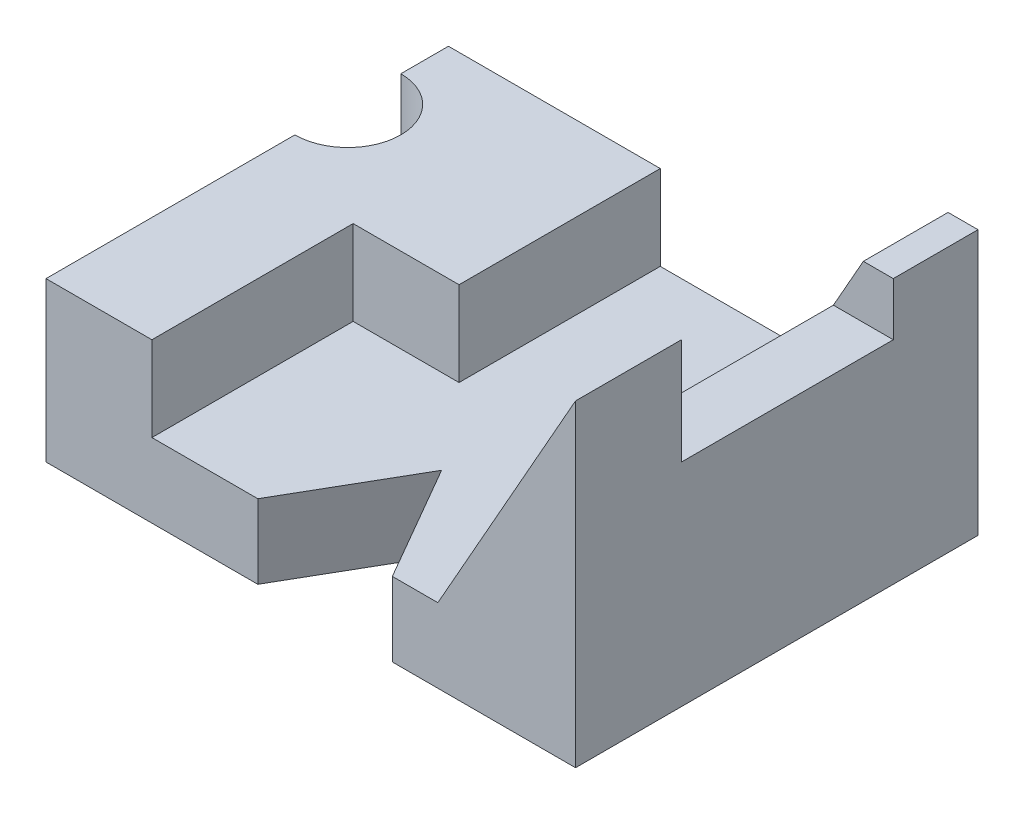
ISO-10303-21;
HEADER;
FILE_DESCRIPTION(('STEP AP214'),'2;1');
FILE_NAME('part.step','',(''),(''),'','','');
FILE_SCHEMA(('AUTOMOTIVE_DESIGN { 1 0 10303 214 1 1 1 1 }'));
ENDSEC;
DATA;
#1=APPLICATION_CONTEXT('core data for automotive mechanical design processes');
#2=APPLICATION_PROTOCOL_DEFINITION('international standard','automotive_design',2000,#1);
#3=PRODUCT_CONTEXT('',#1,'mechanical');
#4=PRODUCT('Part','Part','',(#3));
#5=PRODUCT_RELATED_PRODUCT_CATEGORY('part','',(#4));
#6=PRODUCT_DEFINITION_FORMATION('','',#4);
#7=PRODUCT_DEFINITION_CONTEXT('part definition',#1,'design');
#8=PRODUCT_DEFINITION('design','',#6,#7);
#9=PRODUCT_DEFINITION_SHAPE('','',#8);
#10=(LENGTH_UNIT() NAMED_UNIT(*) SI_UNIT(.MILLI.,.METRE.));
#11=(NAMED_UNIT(*) PLANE_ANGLE_UNIT() SI_UNIT($,.RADIAN.));
#12=(NAMED_UNIT(*) SI_UNIT($,.STERADIAN.) SOLID_ANGLE_UNIT());
#13=UNCERTAINTY_MEASURE_WITH_UNIT(LENGTH_MEASURE(1.E-05),#10,'distance_accuracy_value','');
#14=(GEOMETRIC_REPRESENTATION_CONTEXT(3) GLOBAL_UNCERTAINTY_ASSIGNED_CONTEXT((#13)) GLOBAL_UNIT_ASSIGNED_CONTEXT((#10,
#11,#12)) REPRESENTATION_CONTEXT('',''));
#15=CARTESIAN_POINT('',(0.,0.,0.));
#16=DIRECTION('',(0.,0.,1.));
#17=DIRECTION('',(1.,0.,0.));
#18=AXIS2_PLACEMENT_3D('',#15,#16,#17);
#19=CARTESIAN_POINT('',(0.,0.,38.));
#20=DIRECTION('',(0.,0.,1.));
#21=DIRECTION('',(1.,0.,0.));
#22=AXIS2_PLACEMENT_3D('',#19,#20,#21);
#23=PLANE('',#22);
#24=DIRECTION('',(0.,1.,0.));
#25=VECTOR('',#24,1.);
#26=CARTESIAN_POINT('',(-5.00000000000001,-15.,38.));
#27=LINE('',#26,#25);
#28=CARTESIAN_POINT('',(-5.00000000000001,-15.,38.));
#29=VERTEX_POINT('',#28);
#30=CARTESIAN_POINT('',(-5.00000000000001,-8.,38.));
#31=VERTEX_POINT('',#30);
#32=EDGE_CURVE('E356',#29,#31,#27,.T.);
#33=ORIENTED_EDGE('',*,*,#32,.T.);
#34=DIRECTION('',(1.,0.,0.));
#35=VECTOR('',#34,1.);
#36=CARTESIAN_POINT('',(0.,-8.,38.));
#37=LINE('',#36,#35);
#38=CARTESIAN_POINT('',(-15.,-8.,38.));
#39=VERTEX_POINT('',#38);
#40=EDGE_CURVE('E303',#39,#31,#37,.T.);
#41=ORIENTED_EDGE('',*,*,#40,.F.);
#42=DIRECTION('',(0.,1.,0.));
#43=VECTOR('',#42,1.);
#44=CARTESIAN_POINT('',(-15.,-29.4709105535839,38.));
#45=LINE('',#44,#43);
#46=CARTESIAN_POINT('',(-15.,0.,38.));
#47=VERTEX_POINT('',#46);
#48=EDGE_CURVE('E288',#39,#47,#45,.T.);
#49=ORIENTED_EDGE('',*,*,#48,.T.);
#50=DIRECTION('',(1.,0.,0.));
#51=VECTOR('',#50,1.);
#52=CARTESIAN_POINT('',(0.,0.,38.));
#53=LINE('',#52,#51);
#54=CARTESIAN_POINT('',(-25.,0.,38.));
#55=VERTEX_POINT('',#54);
#56=EDGE_CURVE('E306',#55,#47,#53,.T.);
#57=ORIENTED_EDGE('',*,*,#56,.F.);
#58=DIRECTION('',(0.,1.,0.));
#59=VECTOR('',#58,1.);
#60=CARTESIAN_POINT('',(-25.,0.,38.));
#61=LINE('',#60,#59);
#62=CARTESIAN_POINT('',(-25.,-15.,38.));
#63=VERTEX_POINT('',#62);
#64=EDGE_CURVE('E309',#63,#55,#61,.T.);
#65=ORIENTED_EDGE('',*,*,#64,.F.);
#66=DIRECTION('',(1.,0.,0.));
#67=VECTOR('',#66,1.);
#68=CARTESIAN_POINT('',(0.,-15.,38.));
#69=LINE('',#68,#67);
#70=EDGE_CURVE('E216',#63,#29,#69,.T.);
#71=ORIENTED_EDGE('',*,*,#70,.T.);
#72=EDGE_LOOP('',(#33,#41,#49,#57,#65,#71));
#73=FACE_BOUND('',#72,.T.);
#74=ADVANCED_FACE('F34',(#73),#23,.T.);
#75=CARTESIAN_POINT('',(-25.,0.,38.));
#76=DIRECTION('',(-1.,0.,0.));
#77=DIRECTION('',(0.,0.,1.));
#78=AXIS2_PLACEMENT_3D('',#75,#76,#77);
#79=PLANE('',#78);
#80=DIRECTION('',(0.,1.,0.));
#81=VECTOR('',#80,1.);
#82=CARTESIAN_POINT('',(-25.,0.,11.5));
#83=LINE('',#82,#81);
#84=CARTESIAN_POINT('',(-25.,-15.,11.5));
#85=VERTEX_POINT('',#84);
#86=CARTESIAN_POINT('',(-25.,-8.,11.5));
#87=VERTEX_POINT('',#86);
#88=EDGE_CURVE('E250',#85,#87,#83,.T.);
#89=ORIENTED_EDGE('',*,*,#88,.F.);
#90=DIRECTION('',(0.,0.,-1.));
#91=VECTOR('',#90,1.);
#92=CARTESIAN_POINT('',(-25.,-15.,38.));
#93=LINE('',#92,#91);
#94=EDGE_CURVE('E222',#63,#85,#93,.T.);
#95=ORIENTED_EDGE('',*,*,#94,.F.);
#96=ORIENTED_EDGE('',*,*,#64,.T.);
#97=DIRECTION('',(0.,0.,-1.));
#98=VECTOR('',#97,1.);
#99=CARTESIAN_POINT('',(-25.,0.,38.));
#100=LINE('',#99,#98);
#101=CARTESIAN_POINT('',(-25.,0.,14.5));
#102=VERTEX_POINT('',#101);
#103=EDGE_CURVE('E226',#55,#102,#100,.T.);
#104=ORIENTED_EDGE('',*,*,#103,.T.);
#105=DIRECTION('',(0.,1.,0.));
#106=VECTOR('',#105,1.);
#107=CARTESIAN_POINT('',(-25.,-29.4709105535839,14.5));
#108=LINE('',#107,#106);
#109=CARTESIAN_POINT('',(-25.,-8.,14.5));
#110=VERTEX_POINT('',#109);
#111=EDGE_CURVE('E242',#110,#102,#108,.T.);
#112=ORIENTED_EDGE('',*,*,#111,.F.);
#113=DIRECTION('',(0.,0.,-1.));
#114=VECTOR('',#113,1.);
#115=CARTESIAN_POINT('',(-25.,-8.,38.));
#116=LINE('',#115,#114);
#117=EDGE_CURVE('E236',#110,#87,#116,.T.);
#118=ORIENTED_EDGE('',*,*,#117,.T.);
#119=EDGE_LOOP('',(#89,#95,#96,#104,#112,#118));
#120=FACE_BOUND('',#119,.T.);
#121=ADVANCED_FACE('F370',(#120),#79,.T.);
#122=CARTESIAN_POINT('',(12.5214899713467,-7.07736389684813,38.));
#123=DIRECTION('',(-0.870562838720134,0.492057256667902,0.));
#124=DIRECTION('',(-0.492057256667902,-0.870562838720134,0.));
#125=AXIS2_PLACEMENT_3D('',#122,#123,#124);
#126=PLANE('',#125);
#127=DIRECTION('',(0.,0.,1.));
#128=VECTOR('',#127,1.);
#129=CARTESIAN_POINT('',(22.1739130434783,10.,38.));
#130=LINE('',#129,#128);
#131=CARTESIAN_POINT('',(22.1739130434783,10.,0.));
#132=VERTEX_POINT('',#131);
#133=CARTESIAN_POINT('',(22.1739130434782,10.,8.));
#134=VERTEX_POINT('',#133);
#135=EDGE_CURVE('E193',#132,#134,#130,.T.);
#136=ORIENTED_EDGE('',*,*,#135,.F.);
#137=DIRECTION('',(0.492057256667902,0.870562838720134,0.));
#138=VECTOR('',#137,1.);
#139=CARTESIAN_POINT('',(12.5214899713467,-7.07736389684813,0.));
#140=LINE('',#139,#138);
#141=CARTESIAN_POINT('',(12.,-8.,0.));
#142=VERTEX_POINT('',#141);
#143=EDGE_CURVE('E300',#142,#132,#140,.T.);
#144=ORIENTED_EDGE('',*,*,#143,.F.);
#145=DIRECTION('',(0.,0.,-1.));
#146=VECTOR('',#145,1.);
#147=CARTESIAN_POINT('',(12.,-8.,38.));
#148=LINE('',#147,#146);
#149=CARTESIAN_POINT('',(12.,-8.,38.));
#150=VERTEX_POINT('',#149);
#151=EDGE_CURVE('E233',#150,#142,#148,.T.);
#152=ORIENTED_EDGE('',*,*,#151,.F.);
#153=DIRECTION('',(0.492057256667902,0.870562838720134,0.));
#154=VECTOR('',#153,1.);
#155=CARTESIAN_POINT('',(12.5214899713467,-7.07736389684813,38.));
#156=LINE('',#155,#154);
#157=CARTESIAN_POINT('',(25.,15.,38.));
#158=VERTEX_POINT('',#157);
#159=EDGE_CURVE('E209',#150,#158,#156,.T.);
#160=ORIENTED_EDGE('',*,*,#159,.T.);
#161=DIRECTION('',(0.,0.,-1.));
#162=VECTOR('',#161,1.);
#163=CARTESIAN_POINT('',(25.,15.,38.));
#164=LINE('',#163,#162);
#165=CARTESIAN_POINT('',(25.,15.,28.));
#166=VERTEX_POINT('',#165);
#167=EDGE_CURVE('E200',#158,#166,#164,.T.);
#168=ORIENTED_EDGE('',*,*,#167,.T.);
#169=DIRECTION('',(0.492057256667902,0.870562838720134,0.));
#170=VECTOR('',#169,1.);
#171=CARTESIAN_POINT('',(12.5214899713467,-7.07736389684814,28.));
#172=LINE('',#171,#170);
#173=CARTESIAN_POINT('',(19.3478260869565,4.99999999999999,28.));
#174=VERTEX_POINT('',#173);
#175=EDGE_CURVE('E183',#174,#166,#172,.T.);
#176=ORIENTED_EDGE('',*,*,#175,.F.);
#177=DIRECTION('',(0.,0.,1.));
#178=VECTOR('',#177,1.);
#179=CARTESIAN_POINT('',(19.3478260869565,5.,38.));
#180=LINE('',#179,#178);
#181=CARTESIAN_POINT('',(19.3478260869565,5.,8.));
#182=VERTEX_POINT('',#181);
#183=EDGE_CURVE('E192',#182,#174,#180,.T.);
#184=ORIENTED_EDGE('',*,*,#183,.F.);
#185=DIRECTION('',(-0.492057256667902,-0.870562838720134,0.));
#186=VECTOR('',#185,1.);
#187=CARTESIAN_POINT('',(12.5214899713467,-7.07736389684813,7.99999999999999));
#188=LINE('',#187,#186);
#189=EDGE_CURVE('E340',#134,#182,#188,.T.);
#190=ORIENTED_EDGE('',*,*,#189,.F.);
#191=EDGE_LOOP('',(#136,#144,#152,#160,#168,#176,#184,#190));
#192=FACE_BOUND('',#191,.T.);
#193=ADVANCED_FACE('F36',(#192),#126,.T.);
#194=CARTESIAN_POINT('',(0.,-8.,38.));
#195=DIRECTION('',(0.,1.,0.));
#196=DIRECTION('',(0.,0.,1.));
#197=AXIS2_PLACEMENT_3D('',#194,#195,#196);
#198=PLANE('',#197);
#199=DIRECTION('',(-0.5,0.,0.866025403784439));
#200=VECTOR('',#199,1.);
#201=CARTESIAN_POINT('',(1.35085296108587,-8.,27.));
#202=LINE('',#201,#200);
#203=CARTESIAN_POINT('',(1.35085296108587,-8.,27.));
#204=VERTEX_POINT('',#203);
#205=EDGE_CURVE('E350',#204,#31,#202,.T.);
#206=ORIENTED_EDGE('',*,*,#205,.F.);
#207=DIRECTION('',(-0.5,0.,-0.866025403784438));
#208=VECTOR('',#207,1.);
#209=CARTESIAN_POINT('',(1.35085296108587,-8.,27.));
#210=LINE('',#209,#208);
#211=CARTESIAN_POINT('',(7.70170592217175,-8.,38.));
#212=VERTEX_POINT('',#211);
#213=EDGE_CURVE('E354',#212,#204,#210,.T.);
#214=ORIENTED_EDGE('',*,*,#213,.F.);
#215=EDGE_CURVE('E302',#212,#150,#37,.T.);
#216=ORIENTED_EDGE('',*,*,#215,.T.);
#217=ORIENTED_EDGE('',*,*,#151,.T.);
#218=DIRECTION('',(1.,0.,0.));
#219=VECTOR('',#218,1.);
#220=CARTESIAN_POINT('',(0.,-8.,0.));
#221=LINE('',#220,#219);
#222=CARTESIAN_POINT('',(-5.00000000000001,-8.,0.));
#223=VERTEX_POINT('',#222);
#224=EDGE_CURVE('E317',#223,#142,#221,.T.);
#225=ORIENTED_EDGE('',*,*,#224,.F.);
#226=DIRECTION('',(0.,0.,-1.));
#227=VECTOR('',#226,1.);
#228=CARTESIAN_POINT('',(-5.00000000000001,-8.,38.));
#229=LINE('',#228,#227);
#230=CARTESIAN_POINT('',(-5.00000000000001,-8.,19.));
#231=VERTEX_POINT('',#230);
#232=EDGE_CURVE('E231',#231,#223,#229,.T.);
#233=ORIENTED_EDGE('',*,*,#232,.F.);
#234=DIRECTION('',(1.,0.,0.));
#235=VECTOR('',#234,1.);
#236=CARTESIAN_POINT('',(-5.00000000000001,-8.,19.));
#237=LINE('',#236,#235);
#238=CARTESIAN_POINT('',(-15.,-8.,19.));
#239=VERTEX_POINT('',#238);
#240=EDGE_CURVE('E287',#239,#231,#237,.T.);
#241=ORIENTED_EDGE('',*,*,#240,.F.);
#242=DIRECTION('',(0.,0.,-1.));
#243=VECTOR('',#242,1.);
#244=CARTESIAN_POINT('',(-15.,-8.,19.));
#245=LINE('',#244,#243);
#246=EDGE_CURVE('E285',#39,#239,#245,.T.);
#247=ORIENTED_EDGE('',*,*,#246,.F.);
#248=ORIENTED_EDGE('',*,*,#40,.T.);
#249=EDGE_LOOP('',(#206,#214,#216,#217,#225,#233,#241,#247,#248));
#250=FACE_BOUND('',#249,.T.);
#251=ADVANCED_FACE('F432',(#250),#198,.T.);
#252=CARTESIAN_POINT('',(-5.00000000000001,0.,38.));
#253=DIRECTION('',(1.,0.,0.));
#254=DIRECTION('',(0.,1.,0.));
#255=AXIS2_PLACEMENT_3D('',#252,#253,#254);
#256=PLANE('',#255);
#257=DIRECTION('',(0.,1.,0.));
#258=VECTOR('',#257,1.);
#259=CARTESIAN_POINT('',(-5.00000000000001,-29.4709105535839,19.));
#260=LINE('',#259,#258);
#261=CARTESIAN_POINT('',(-5.00000000000001,0.,19.));
#262=VERTEX_POINT('',#261);
#263=EDGE_CURVE('E293',#231,#262,#260,.T.);
#264=ORIENTED_EDGE('',*,*,#263,.F.);
#265=ORIENTED_EDGE('',*,*,#232,.T.);
#266=DIRECTION('',(0.,-1.,0.));
#267=VECTOR('',#266,1.);
#268=CARTESIAN_POINT('',(-5.00000000000001,0.,0.));
#269=LINE('',#268,#267);
#270=CARTESIAN_POINT('',(-5.00000000000001,0.,0.));
#271=VERTEX_POINT('',#270);
#272=EDGE_CURVE('E320',#271,#223,#269,.T.);
#273=ORIENTED_EDGE('',*,*,#272,.F.);
#274=DIRECTION('',(0.,0.,-1.));
#275=VECTOR('',#274,1.);
#276=CARTESIAN_POINT('',(-5.00000000000001,0.,38.));
#277=LINE('',#276,#275);
#278=EDGE_CURVE('E229',#262,#271,#277,.T.);
#279=ORIENTED_EDGE('',*,*,#278,.F.);
#280=EDGE_LOOP('',(#264,#265,#273,#279));
#281=FACE_BOUND('',#280,.T.);
#282=ADVANCED_FACE('F439',(#281),#256,.T.);
#283=CARTESIAN_POINT('',(0.,0.,38.));
#284=DIRECTION('',(0.,1.,0.));
#285=DIRECTION('',(-1.,0.,0.));
#286=AXIS2_PLACEMENT_3D('',#283,#284,#285);
#287=PLANE('',#286);
#288=CARTESIAN_POINT('',(-25.,0.,9.50000000000001));
#289=DIRECTION('',(0.,1.,0.));
#290=DIRECTION('',(-1.,0.,0.));
#291=AXIS2_PLACEMENT_3D('',#288,#289,#290);
#292=CIRCLE('',#291,5.);
#293=CARTESIAN_POINT('',(-25.,0.,4.5));
#294=VERTEX_POINT('',#293);
#295=EDGE_CURVE('E279',#102,#294,#292,.T.);
#296=ORIENTED_EDGE('',*,*,#295,.F.);
#297=ORIENTED_EDGE('',*,*,#103,.F.);
#298=ORIENTED_EDGE('',*,*,#56,.T.);
#299=DIRECTION('',(0.,0.,1.));
#300=VECTOR('',#299,1.);
#301=CARTESIAN_POINT('',(-15.,0.,19.));
#302=LINE('',#301,#300);
#303=CARTESIAN_POINT('',(-15.,0.,19.));
#304=VERTEX_POINT('',#303);
#305=EDGE_CURVE('E291',#304,#47,#302,.T.);
#306=ORIENTED_EDGE('',*,*,#305,.F.);
#307=DIRECTION('',(-1.,0.,0.));
#308=VECTOR('',#307,1.);
#309=CARTESIAN_POINT('',(-5.00000000000001,0.,19.));
#310=LINE('',#309,#308);
#311=EDGE_CURVE('E284',#262,#304,#310,.T.);
#312=ORIENTED_EDGE('',*,*,#311,.F.);
#313=ORIENTED_EDGE('',*,*,#278,.T.);
#314=DIRECTION('',(1.,0.,0.));
#315=VECTOR('',#314,1.);
#316=CARTESIAN_POINT('',(0.,0.,0.));
#317=LINE('',#316,#315);
#318=CARTESIAN_POINT('',(-25.,0.,0.));
#319=VERTEX_POINT('',#318);
#320=EDGE_CURVE('E323',#319,#271,#317,.T.);
#321=ORIENTED_EDGE('',*,*,#320,.F.);
#322=EDGE_CURVE('E225',#294,#319,#100,.T.);
#323=ORIENTED_EDGE('',*,*,#322,.F.);
#324=EDGE_LOOP('',(#296,#297,#298,#306,#312,#313,#321,#323));
#325=FACE_BOUND('',#324,.T.);
#326=ADVANCED_FACE('F383',(#325),#287,.T.);
#327=DIRECTION('',(0.,-1.,0.));
#328=VECTOR('',#327,1.);
#329=CARTESIAN_POINT('',(-25.,0.,7.50000000000001));
#330=LINE('',#329,#328);
#331=CARTESIAN_POINT('',(-25.,-8.,7.50000000000001));
#332=VERTEX_POINT('',#331);
#333=CARTESIAN_POINT('',(-25.,-15.,7.50000000000001));
#334=VERTEX_POINT('',#333);
#335=EDGE_CURVE('E260',#332,#334,#330,.T.);
#336=ORIENTED_EDGE('',*,*,#335,.F.);
#337=CARTESIAN_POINT('',(-25.,-8.,4.5));
#338=VERTEX_POINT('',#337);
#339=EDGE_CURVE('E235',#332,#338,#116,.T.);
#340=ORIENTED_EDGE('',*,*,#339,.T.);
#341=DIRECTION('',(0.,1.,0.));
#342=VECTOR('',#341,1.);
#343=CARTESIAN_POINT('',(-25.,-29.4709105535839,4.5));
#344=LINE('',#343,#342);
#345=EDGE_CURVE('E239',#294,#338,#344,.F.);
#346=ORIENTED_EDGE('',*,*,#345,.F.);
#347=ORIENTED_EDGE('',*,*,#322,.T.);
#348=DIRECTION('',(0.,1.,0.));
#349=VECTOR('',#348,1.);
#350=CARTESIAN_POINT('',(-25.,0.,0.));
#351=LINE('',#350,#349);
#352=CARTESIAN_POINT('',(-25.,-15.,0.));
#353=VERTEX_POINT('',#352);
#354=EDGE_CURVE('E326',#353,#319,#351,.T.);
#355=ORIENTED_EDGE('',*,*,#354,.F.);
#356=EDGE_CURVE('E214',#334,#353,#93,.T.);
#357=ORIENTED_EDGE('',*,*,#356,.F.);
#358=EDGE_LOOP('',(#336,#340,#346,#347,#355,#357));
#359=FACE_BOUND('',#358,.T.);
#360=ADVANCED_FACE('F380',(#359),#79,.T.);
#361=CARTESIAN_POINT('',(0.,-15.,38.));
#362=DIRECTION('',(0.,1.,0.));
#363=DIRECTION('',(0.,0.,1.));
#364=AXIS2_PLACEMENT_3D('',#361,#362,#363);
#365=PLANE('',#364);
#366=DIRECTION('',(-0.5,0.,-0.866025403784438));
#367=VECTOR('',#366,1.);
#368=CARTESIAN_POINT('',(1.35085296108587,-15.,27.));
#369=LINE('',#368,#367);
#370=CARTESIAN_POINT('',(7.70170592217175,-15.,38.));
#371=VERTEX_POINT('',#370);
#372=CARTESIAN_POINT('',(1.35085296108587,-15.,27.));
#373=VERTEX_POINT('',#372);
#374=EDGE_CURVE('E56',#371,#373,#369,.T.);
#375=ORIENTED_EDGE('',*,*,#374,.T.);
#376=DIRECTION('',(-0.5,0.,0.866025403784439));
#377=VECTOR('',#376,1.);
#378=CARTESIAN_POINT('',(1.35085296108587,-15.,27.));
#379=LINE('',#378,#377);
#380=EDGE_CURVE('E351',#373,#29,#379,.T.);
#381=ORIENTED_EDGE('',*,*,#380,.T.);
#382=ORIENTED_EDGE('',*,*,#70,.F.);
#383=ORIENTED_EDGE('',*,*,#94,.T.);
#384=DIRECTION('',(1.,0.,0.));
#385=VECTOR('',#384,1.);
#386=CARTESIAN_POINT('',(-27.,-15.,11.5));
#387=LINE('',#386,#385);
#388=CARTESIAN_POINT('',(-23.,-15.,11.5));
#389=VERTEX_POINT('',#388);
#390=EDGE_CURVE('E273',#85,#389,#387,.T.);
#391=ORIENTED_EDGE('',*,*,#390,.T.);
#392=DIRECTION('',(0.,0.,-1.));
#393=VECTOR('',#392,1.);
#394=CARTESIAN_POINT('',(-23.,-15.,11.5));
#395=LINE('',#394,#393);
#396=CARTESIAN_POINT('',(-23.,-15.,7.50000000000001));
#397=VERTEX_POINT('',#396);
#398=EDGE_CURVE('E258',#389,#397,#395,.T.);
#399=ORIENTED_EDGE('',*,*,#398,.T.);
#400=DIRECTION('',(-1.,0.,0.));
#401=VECTOR('',#400,1.);
#402=CARTESIAN_POINT('',(-27.,-15.,7.50000000000001));
#403=LINE('',#402,#401);
#404=EDGE_CURVE('E363',#397,#334,#403,.T.);
#405=ORIENTED_EDGE('',*,*,#404,.T.);
#406=ORIENTED_EDGE('',*,*,#356,.T.);
#407=DIRECTION('',(1.,0.,0.));
#408=VECTOR('',#407,1.);
#409=CARTESIAN_POINT('',(0.,-15.,0.));
#410=LINE('',#409,#408);
#411=CARTESIAN_POINT('',(25.,-15.,0.));
#412=VERTEX_POINT('',#411);
#413=EDGE_CURVE('E328',#353,#412,#410,.T.);
#414=ORIENTED_EDGE('',*,*,#413,.T.);
#415=DIRECTION('',(0.,0.,-1.));
#416=VECTOR('',#415,1.);
#417=CARTESIAN_POINT('',(25.,-15.,38.));
#418=LINE('',#417,#416);
#419=CARTESIAN_POINT('',(25.,-15.,38.));
#420=VERTEX_POINT('',#419);
#421=EDGE_CURVE('E210',#420,#412,#418,.T.);
#422=ORIENTED_EDGE('',*,*,#421,.F.);
#423=EDGE_CURVE('E312',#371,#420,#69,.T.);
#424=ORIENTED_EDGE('',*,*,#423,.F.);
#425=EDGE_LOOP('',(#375,#381,#382,#383,#391,#399,#405,#406,#414,#422,#424));
#426=FACE_BOUND('',#425,.T.);
#427=ADVANCED_FACE('F367',(#426),#365,.F.);
#428=CARTESIAN_POINT('',(25.,0.,38.));
#429=DIRECTION('',(-1.,0.,0.));
#430=DIRECTION('',(0.,0.,1.));
#431=AXIS2_PLACEMENT_3D('',#428,#429,#430);
#432=PLANE('',#431);
#433=DIRECTION('',(0.,1.,0.));
#434=VECTOR('',#433,1.);
#435=CARTESIAN_POINT('',(25.,0.,0.));
#436=LINE('',#435,#434);
#437=CARTESIAN_POINT('',(25.,10.,0.));
#438=VERTEX_POINT('',#437);
#439=EDGE_CURVE('E219',#412,#438,#436,.T.);
#440=ORIENTED_EDGE('',*,*,#439,.T.);
#441=DIRECTION('',(0.,0.,-1.));
#442=VECTOR('',#441,1.);
#443=CARTESIAN_POINT('',(25.,10.,8.));
#444=LINE('',#443,#442);
#445=CARTESIAN_POINT('',(25.,10.,8.));
#446=VERTEX_POINT('',#445);
#447=EDGE_CURVE('E49',#446,#438,#444,.T.);
#448=ORIENTED_EDGE('',*,*,#447,.F.);
#449=DIRECTION('',(0.,1.,0.));
#450=VECTOR('',#449,1.);
#451=CARTESIAN_POINT('',(25.,10.,8.));
#452=LINE('',#451,#450);
#453=CARTESIAN_POINT('',(25.,5.,8.));
#454=VERTEX_POINT('',#453);
#455=EDGE_CURVE('E463',#454,#446,#452,.T.);
#456=ORIENTED_EDGE('',*,*,#455,.F.);
#457=DIRECTION('',(0.,0.,-1.));
#458=VECTOR('',#457,1.);
#459=CARTESIAN_POINT('',(25.,5.,8.));
#460=LINE('',#459,#458);
#461=CARTESIAN_POINT('',(25.,5.,28.));
#462=VERTEX_POINT('',#461);
#463=EDGE_CURVE('E204',#462,#454,#460,.T.);
#464=ORIENTED_EDGE('',*,*,#463,.F.);
#465=DIRECTION('',(0.,-1.,0.));
#466=VECTOR('',#465,1.);
#467=CARTESIAN_POINT('',(25.,15.,28.));
#468=LINE('',#467,#466);
#469=EDGE_CURVE('E186',#166,#462,#468,.T.);
#470=ORIENTED_EDGE('',*,*,#469,.F.);
#471=ORIENTED_EDGE('',*,*,#167,.F.);
#472=DIRECTION('',(0.,1.,0.));
#473=VECTOR('',#472,1.);
#474=CARTESIAN_POINT('',(25.,0.,38.));
#475=LINE('',#474,#473);
#476=EDGE_CURVE('E211',#420,#158,#475,.T.);
#477=ORIENTED_EDGE('',*,*,#476,.F.);
#478=ORIENTED_EDGE('',*,*,#421,.T.);
#479=EDGE_LOOP('',(#440,#448,#456,#464,#470,#471,#477,#478));
#480=FACE_BOUND('',#479,.T.);
#481=ADVANCED_FACE('F198',(#480),#432,.F.);
#482=DIRECTION('',(0.,1.,0.));
#483=VECTOR('',#482,1.);
#484=CARTESIAN_POINT('',(7.70170592217175,-15.,38.));
#485=LINE('',#484,#483);
#486=EDGE_CURVE('E270',#371,#212,#485,.T.);
#487=ORIENTED_EDGE('',*,*,#486,.F.);
#488=ORIENTED_EDGE('',*,*,#423,.T.);
#489=ORIENTED_EDGE('',*,*,#476,.T.);
#490=ORIENTED_EDGE('',*,*,#159,.F.);
#491=ORIENTED_EDGE('',*,*,#215,.F.);
#492=EDGE_LOOP('',(#487,#488,#489,#490,#491));
#493=FACE_BOUND('',#492,.T.);
#494=ADVANCED_FACE('F404',(#493),#23,.T.);
#495=CARTESIAN_POINT('',(0.,0.,0.));
#496=DIRECTION('',(0.,0.,1.));
#497=DIRECTION('',(1.,0.,0.));
#498=AXIS2_PLACEMENT_3D('',#495,#496,#497);
#499=PLANE('',#498);
#500=ORIENTED_EDGE('',*,*,#143,.T.);
#501=DIRECTION('',(1.,0.,0.));
#502=VECTOR('',#501,1.);
#503=CARTESIAN_POINT('',(0.,10.,0.));
#504=LINE('',#503,#502);
#505=EDGE_CURVE('E11',#132,#438,#504,.T.);
#506=ORIENTED_EDGE('',*,*,#505,.T.);
#507=ORIENTED_EDGE('',*,*,#439,.F.);
#508=ORIENTED_EDGE('',*,*,#413,.F.);
#509=ORIENTED_EDGE('',*,*,#354,.T.);
#510=ORIENTED_EDGE('',*,*,#320,.T.);
#511=ORIENTED_EDGE('',*,*,#272,.T.);
#512=ORIENTED_EDGE('',*,*,#224,.T.);
#513=EDGE_LOOP('',(#500,#506,#507,#508,#509,#510,#511,#512));
#514=FACE_BOUND('',#513,.T.);
#515=ADVANCED_FACE('F334',(#514),#499,.F.);
#516=CARTESIAN_POINT('',(-15.,-29.4709105535839,19.));
#517=DIRECTION('',(-1.,0.,0.));
#518=DIRECTION('',(0.,0.,1.));
#519=AXIS2_PLACEMENT_3D('',#516,#517,#518);
#520=PLANE('',#519);
#521=ORIENTED_EDGE('',*,*,#246,.T.);
#522=DIRECTION('',(0.,1.,0.));
#523=VECTOR('',#522,1.);
#524=CARTESIAN_POINT('',(-15.,-29.4709105535839,19.));
#525=LINE('',#524,#523);
#526=EDGE_CURVE('E296',#239,#304,#525,.T.);
#527=ORIENTED_EDGE('',*,*,#526,.T.);
#528=ORIENTED_EDGE('',*,*,#305,.T.);
#529=ORIENTED_EDGE('',*,*,#48,.F.);
#530=EDGE_LOOP('',(#521,#527,#528,#529));
#531=FACE_BOUND('',#530,.T.);
#532=ADVANCED_FACE('F417',(#531),#520,.F.);
#533=CARTESIAN_POINT('',(-5.00000000000001,-29.4709105535839,19.));
#534=DIRECTION('',(0.,0.,-1.));
#535=DIRECTION('',(-1.,0.,0.));
#536=AXIS2_PLACEMENT_3D('',#533,#534,#535);
#537=PLANE('',#536);
#538=ORIENTED_EDGE('',*,*,#240,.T.);
#539=ORIENTED_EDGE('',*,*,#263,.T.);
#540=ORIENTED_EDGE('',*,*,#311,.T.);
#541=ORIENTED_EDGE('',*,*,#526,.F.);
#542=EDGE_LOOP('',(#538,#539,#540,#541));
#543=FACE_BOUND('',#542,.T.);
#544=ADVANCED_FACE('F436',(#543),#537,.F.);
#545=CARTESIAN_POINT('',(-25.,-29.4709105535839,9.50000000000001));
#546=DIRECTION('',(0.,1.,0.));
#547=DIRECTION('',(-1.,0.,0.));
#548=AXIS2_PLACEMENT_3D('',#545,#546,#547);
#549=CYLINDRICAL_SURFACE('',#548,5.);
#550=ORIENTED_EDGE('',*,*,#111,.T.);
#551=ORIENTED_EDGE('',*,*,#295,.T.);
#552=ORIENTED_EDGE('',*,*,#345,.T.);
#553=CARTESIAN_POINT('',(-25.,-8.,9.50000000000001));
#554=DIRECTION('',(0.,1.,0.));
#555=DIRECTION('',(0.,0.,1.));
#556=AXIS2_PLACEMENT_3D('',#553,#554,#555);
#557=CIRCLE('',#556,5.);
#558=EDGE_CURVE('E281',#338,#110,#557,.F.);
#559=ORIENTED_EDGE('',*,*,#558,.T.);
#560=EDGE_LOOP('',(#550,#551,#552,#559));
#561=FACE_BOUND('',#560,.T.);
#562=ADVANCED_FACE('F374',(#561),#549,.F.);
#563=CARTESIAN_POINT('',(0.,-8.,38.));
#564=DIRECTION('',(0.,1.,0.));
#565=DIRECTION('',(0.,0.,1.));
#566=AXIS2_PLACEMENT_3D('',#563,#564,#565);
#567=PLANE('',#566);
#568=DIRECTION('',(1.,0.,0.));
#569=VECTOR('',#568,1.);
#570=CARTESIAN_POINT('',(0.,-8.,11.5));
#571=LINE('',#570,#569);
#572=CARTESIAN_POINT('',(-23.,-8.,11.5));
#573=VERTEX_POINT('',#572);
#574=EDGE_CURVE('E42',#87,#573,#571,.T.);
#575=ORIENTED_EDGE('',*,*,#574,.F.);
#576=ORIENTED_EDGE('',*,*,#117,.F.);
#577=ORIENTED_EDGE('',*,*,#558,.F.);
#578=ORIENTED_EDGE('',*,*,#339,.F.);
#579=DIRECTION('',(-1.,0.,0.));
#580=VECTOR('',#579,1.);
#581=CARTESIAN_POINT('',(-27.,-8.,7.50000000000001));
#582=LINE('',#581,#580);
#583=CARTESIAN_POINT('',(-23.,-8.,7.50000000000001));
#584=VERTEX_POINT('',#583);
#585=EDGE_CURVE('E266',#584,#332,#582,.T.);
#586=ORIENTED_EDGE('',*,*,#585,.F.);
#587=DIRECTION('',(0.,0.,-1.));
#588=VECTOR('',#587,1.);
#589=CARTESIAN_POINT('',(-23.,-8.,11.5));
#590=LINE('',#589,#588);
#591=EDGE_CURVE('E255',#573,#584,#590,.T.);
#592=ORIENTED_EDGE('',*,*,#591,.F.);
#593=EDGE_LOOP('',(#575,#576,#577,#578,#586,#592));
#594=FACE_BOUND('',#593,.T.);
#595=ADVANCED_FACE('F264',(#594),#567,.T.);
#596=CARTESIAN_POINT('',(-23.,-15.,11.5));
#597=DIRECTION('',(1.,0.,0.));
#598=DIRECTION('',(0.,0.,-1.));
#599=AXIS2_PLACEMENT_3D('',#596,#597,#598);
#600=PLANE('',#599);
#601=ORIENTED_EDGE('',*,*,#591,.T.);
#602=DIRECTION('',(0.,1.,0.));
#603=VECTOR('',#602,1.);
#604=CARTESIAN_POINT('',(-23.,-15.,7.50000000000001));
#605=LINE('',#604,#603);
#606=EDGE_CURVE('E261',#397,#584,#605,.T.);
#607=ORIENTED_EDGE('',*,*,#606,.F.);
#608=ORIENTED_EDGE('',*,*,#398,.F.);
#609=DIRECTION('',(0.,1.,0.));
#610=VECTOR('',#609,1.);
#611=CARTESIAN_POINT('',(-23.,-15.,11.5));
#612=LINE('',#611,#610);
#613=EDGE_CURVE('E247',#389,#573,#612,.T.);
#614=ORIENTED_EDGE('',*,*,#613,.T.);
#615=EDGE_LOOP('',(#601,#607,#608,#614));
#616=FACE_BOUND('',#615,.T.);
#617=ADVANCED_FACE('F254',(#616),#600,.F.);
#618=CARTESIAN_POINT('',(-27.,-15.,11.5));
#619=DIRECTION('',(0.,0.,1.));
#620=DIRECTION('',(1.,0.,0.));
#621=AXIS2_PLACEMENT_3D('',#618,#619,#620);
#622=PLANE('',#621);
#623=ORIENTED_EDGE('',*,*,#88,.T.);
#624=ORIENTED_EDGE('',*,*,#574,.T.);
#625=ORIENTED_EDGE('',*,*,#613,.F.);
#626=ORIENTED_EDGE('',*,*,#390,.F.);
#627=EDGE_LOOP('',(#623,#624,#625,#626));
#628=FACE_BOUND('',#627,.T.);
#629=ADVANCED_FACE('F246',(#628),#622,.F.);
#630=CARTESIAN_POINT('',(-27.,-15.,7.50000000000001));
#631=DIRECTION('',(0.,0.,-1.));
#632=DIRECTION('',(-1.,0.,0.));
#633=AXIS2_PLACEMENT_3D('',#630,#631,#632);
#634=PLANE('',#633);
#635=ORIENTED_EDGE('',*,*,#335,.T.);
#636=ORIENTED_EDGE('',*,*,#404,.F.);
#637=ORIENTED_EDGE('',*,*,#606,.T.);
#638=ORIENTED_EDGE('',*,*,#585,.T.);
#639=EDGE_LOOP('',(#635,#636,#637,#638));
#640=FACE_BOUND('',#639,.T.);
#641=ADVANCED_FACE('F388',(#640),#634,.F.);
#642=CARTESIAN_POINT('',(1.35085296108587,-15.,27.));
#643=DIRECTION('',(-0.866025403784439,0.,-0.5));
#644=DIRECTION('',(-0.5,0.,0.866025403784439));
#645=AXIS2_PLACEMENT_3D('',#642,#643,#644);
#646=PLANE('',#645);
#647=ORIENTED_EDGE('',*,*,#205,.T.);
#648=ORIENTED_EDGE('',*,*,#32,.F.);
#649=ORIENTED_EDGE('',*,*,#380,.F.);
#650=DIRECTION('',(0.,1.,0.));
#651=VECTOR('',#650,1.);
#652=CARTESIAN_POINT('',(1.35085296108587,-15.,27.));
#653=LINE('',#652,#651);
#654=EDGE_CURVE('E267',#373,#204,#653,.T.);
#655=ORIENTED_EDGE('',*,*,#654,.T.);
#656=EDGE_LOOP('',(#647,#648,#649,#655));
#657=FACE_BOUND('',#656,.T.);
#658=ADVANCED_FACE('F390',(#657),#646,.F.);
#659=CARTESIAN_POINT('',(1.35085296108587,-15.,27.));
#660=DIRECTION('',(0.866025403784438,0.,-0.5));
#661=DIRECTION('',(-0.5,0.,-0.866025403784439));
#662=AXIS2_PLACEMENT_3D('',#659,#660,#661);
#663=PLANE('',#662);
#664=ORIENTED_EDGE('',*,*,#213,.T.);
#665=ORIENTED_EDGE('',*,*,#654,.F.);
#666=ORIENTED_EDGE('',*,*,#374,.F.);
#667=ORIENTED_EDGE('',*,*,#486,.T.);
#668=EDGE_LOOP('',(#664,#665,#666,#667));
#669=FACE_BOUND('',#668,.T.);
#670=ADVANCED_FACE('F396',(#669),#663,.F.);
#671=CARTESIAN_POINT('',(-25.,10.,8.));
#672=DIRECTION('',(0.,-1.,0.));
#673=DIRECTION('',(0.,0.,-1.));
#674=AXIS2_PLACEMENT_3D('',#671,#672,#673);
#675=PLANE('',#674);
#676=ORIENTED_EDGE('',*,*,#135,.T.);
#677=DIRECTION('',(1.,0.,0.));
#678=VECTOR('',#677,1.);
#679=CARTESIAN_POINT('',(-25.,10.,8.));
#680=LINE('',#679,#678);
#681=EDGE_CURVE('E341',#134,#446,#680,.T.);
#682=ORIENTED_EDGE('',*,*,#681,.T.);
#683=ORIENTED_EDGE('',*,*,#447,.T.);
#684=ORIENTED_EDGE('',*,*,#505,.F.);
#685=EDGE_LOOP('',(#676,#682,#683,#684));
#686=FACE_BOUND('',#685,.T.);
#687=ADVANCED_FACE('F337',(#686),#675,.F.);
#688=CARTESIAN_POINT('',(-25.,10.,8.));
#689=DIRECTION('',(0.,0.,-1.));
#690=DIRECTION('',(0.,1.,0.));
#691=AXIS2_PLACEMENT_3D('',#688,#689,#690);
#692=PLANE('',#691);
#693=ORIENTED_EDGE('',*,*,#189,.T.);
#694=DIRECTION('',(1.,0.,0.));
#695=VECTOR('',#694,1.);
#696=CARTESIAN_POINT('',(-25.,5.,8.));
#697=LINE('',#696,#695);
#698=EDGE_CURVE('E343',#182,#454,#697,.T.);
#699=ORIENTED_EDGE('',*,*,#698,.T.);
#700=ORIENTED_EDGE('',*,*,#455,.T.);
#701=ORIENTED_EDGE('',*,*,#681,.F.);
#702=EDGE_LOOP('',(#693,#699,#700,#701));
#703=FACE_BOUND('',#702,.T.);
#704=ADVANCED_FACE('F446',(#703),#692,.F.);
#705=CARTESIAN_POINT('',(-25.,5.,8.));
#706=DIRECTION('',(0.,-1.,0.));
#707=DIRECTION('',(0.,0.,-1.));
#708=AXIS2_PLACEMENT_3D('',#705,#706,#707);
#709=PLANE('',#708);
#710=ORIENTED_EDGE('',*,*,#183,.T.);
#711=DIRECTION('',(1.,0.,0.));
#712=VECTOR('',#711,1.);
#713=CARTESIAN_POINT('',(-25.,5.,28.));
#714=LINE('',#713,#712);
#715=EDGE_CURVE('E188',#174,#462,#714,.T.);
#716=ORIENTED_EDGE('',*,*,#715,.T.);
#717=ORIENTED_EDGE('',*,*,#463,.T.);
#718=ORIENTED_EDGE('',*,*,#698,.F.);
#719=EDGE_LOOP('',(#710,#716,#717,#718));
#720=FACE_BOUND('',#719,.T.);
#721=ADVANCED_FACE('F451',(#720),#709,.F.);
#722=CARTESIAN_POINT('',(-25.,15.,28.));
#723=DIRECTION('',(0.,0.,1.));
#724=DIRECTION('',(0.,-1.,0.));
#725=AXIS2_PLACEMENT_3D('',#722,#723,#724);
#726=PLANE('',#725);
#727=ORIENTED_EDGE('',*,*,#175,.T.);
#728=ORIENTED_EDGE('',*,*,#469,.T.);
#729=ORIENTED_EDGE('',*,*,#715,.F.);
#730=EDGE_LOOP('',(#727,#728,#729));
#731=FACE_BOUND('',#730,.T.);
#732=ADVANCED_FACE('F185',(#731),#726,.F.);
#733=CLOSED_SHELL('',(#74,#121,#193,#251,#282,#326,#360,#427,#481,#494,#515,#532,#544,#562,#595,
#617,#629,#641,#658,#670,#687,#704,#721,#732));
#734=MANIFOLD_SOLID_BREP('B2',#733);
#735=ADVANCED_BREP_SHAPE_REPRESENTATION('',(#18,#734),#14);
#736=SHAPE_DEFINITION_REPRESENTATION(#9,#735);
ENDSEC;
END-ISO-10303-21;
